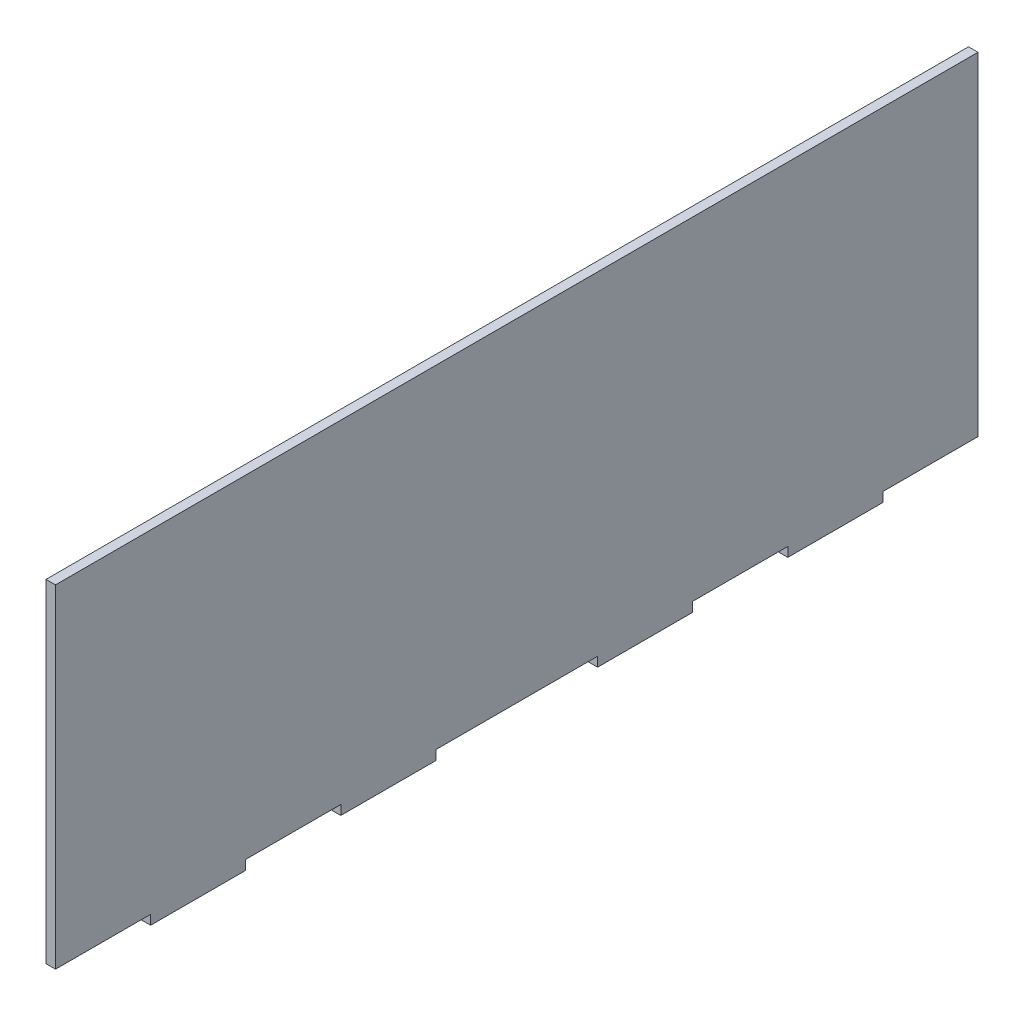
ISO-10303-21;
HEADER;
FILE_DESCRIPTION(('STEP AP214'),'2;1');
FILE_NAME('part.step','',(''),(''),'','','');
FILE_SCHEMA(('AUTOMOTIVE_DESIGN { 1 0 10303 214 1 1 1 1 }'));
ENDSEC;
DATA;
#1=APPLICATION_CONTEXT('core data for automotive mechanical design processes');
#2=APPLICATION_PROTOCOL_DEFINITION('international standard','automotive_design',2000,#1);
#3=PRODUCT_CONTEXT('',#1,'mechanical');
#4=PRODUCT('Part','Part','',(#3));
#5=PRODUCT_RELATED_PRODUCT_CATEGORY('part','',(#4));
#6=PRODUCT_DEFINITION_FORMATION('','',#4);
#7=PRODUCT_DEFINITION_CONTEXT('part definition',#1,'design');
#8=PRODUCT_DEFINITION('design','',#6,#7);
#9=PRODUCT_DEFINITION_SHAPE('','',#8);
#10=(LENGTH_UNIT() NAMED_UNIT(*) SI_UNIT(.MILLI.,.METRE.));
#11=(NAMED_UNIT(*) PLANE_ANGLE_UNIT() SI_UNIT($,.RADIAN.));
#12=(NAMED_UNIT(*) SI_UNIT($,.STERADIAN.) SOLID_ANGLE_UNIT());
#13=UNCERTAINTY_MEASURE_WITH_UNIT(LENGTH_MEASURE(1.E-05),#10,'distance_accuracy_value','');
#14=(GEOMETRIC_REPRESENTATION_CONTEXT(3) GLOBAL_UNCERTAINTY_ASSIGNED_CONTEXT((#13)) GLOBAL_UNIT_ASSIGNED_CONTEXT((#10,
#11,#12)) REPRESENTATION_CONTEXT('',''));
#15=CARTESIAN_POINT('',(0.,0.,0.));
#16=DIRECTION('',(0.,0.,1.));
#17=DIRECTION('',(1.,0.,0.));
#18=AXIS2_PLACEMENT_3D('',#15,#16,#17);
#19=CARTESIAN_POINT('',(2.,-35.,96.9999999999999));
#20=DIRECTION('',(0.,1.,0.));
#21=DIRECTION('',(0.,0.,1.));
#22=AXIS2_PLACEMENT_3D('',#19,#20,#21);
#23=PLANE('',#22);
#24=DIRECTION('',(0.,0.,-1.));
#25=VECTOR('',#24,1.);
#26=CARTESIAN_POINT('',(2.,-35.,96.9999999999999));
#27=LINE('',#26,#25);
#28=CARTESIAN_POINT('',(2.,-35.,-77.));
#29=VERTEX_POINT('',#28);
#30=CARTESIAN_POINT('',(2.,-35.,-96.9999999999999));
#31=VERTEX_POINT('',#30);
#32=EDGE_CURVE('E48',#29,#31,#27,.T.);
#33=ORIENTED_EDGE('',*,*,#32,.F.);
#34=DIRECTION('',(1.,0.,0.));
#35=VECTOR('',#34,1.);
#36=CARTESIAN_POINT('',(0.,-35.,-77.));
#37=LINE('',#36,#35);
#38=CARTESIAN_POINT('',(0.,-35.,-77.));
#39=VERTEX_POINT('',#38);
#40=EDGE_CURVE('E184',#39,#29,#37,.T.);
#41=ORIENTED_EDGE('',*,*,#40,.F.);
#42=DIRECTION('',(0.,0.,-1.));
#43=VECTOR('',#42,1.);
#44=CARTESIAN_POINT('',(0.,-35.,96.9999999999999));
#45=LINE('',#44,#43);
#46=CARTESIAN_POINT('',(0.,-35.,-96.9999999999999));
#47=VERTEX_POINT('',#46);
#48=EDGE_CURVE('E171',#39,#47,#45,.T.);
#49=ORIENTED_EDGE('',*,*,#48,.T.);
#50=DIRECTION('',(-1.,0.,0.));
#51=VECTOR('',#50,1.);
#52=CARTESIAN_POINT('',(2.,-35.,-96.9999999999999));
#53=LINE('',#52,#51);
#54=EDGE_CURVE('E301',#31,#47,#53,.T.);
#55=ORIENTED_EDGE('',*,*,#54,.F.);
#56=EDGE_LOOP('',(#33,#41,#49,#55));
#57=FACE_BOUND('',#56,.T.);
#58=ADVANCED_FACE('F33',(#57),#23,.F.);
#59=CARTESIAN_POINT('',(0.,-35.,-37.));
#60=VERTEX_POINT('',#59);
#61=CARTESIAN_POINT('',(0.,-35.,-57.));
#62=VERTEX_POINT('',#61);
#63=EDGE_CURVE('E180',#60,#62,#45,.T.);
#64=ORIENTED_EDGE('',*,*,#63,.T.);
#65=DIRECTION('',(1.,0.,0.));
#66=VECTOR('',#65,1.);
#67=CARTESIAN_POINT('',(0.,-35.,-57.));
#68=LINE('',#67,#66);
#69=CARTESIAN_POINT('',(2.,-35.,-57.));
#70=VERTEX_POINT('',#69);
#71=EDGE_CURVE('E56',#62,#70,#68,.T.);
#72=ORIENTED_EDGE('',*,*,#71,.T.);
#73=CARTESIAN_POINT('',(2.,-35.,-37.));
#74=VERTEX_POINT('',#73);
#75=EDGE_CURVE('E376',#74,#70,#27,.T.);
#76=ORIENTED_EDGE('',*,*,#75,.F.);
#77=DIRECTION('',(1.,0.,0.));
#78=VECTOR('',#77,1.);
#79=CARTESIAN_POINT('',(0.,-35.,-37.));
#80=LINE('',#79,#78);
#81=EDGE_CURVE('E221',#60,#74,#80,.T.);
#82=ORIENTED_EDGE('',*,*,#81,.F.);
#83=EDGE_LOOP('',(#64,#72,#76,#82));
#84=FACE_BOUND('',#83,.T.);
#85=ADVANCED_FACE('F342',(#84),#23,.F.);
#86=CARTESIAN_POINT('',(0.,-35.,57.));
#87=VERTEX_POINT('',#86);
#88=CARTESIAN_POINT('',(0.,-35.,37.));
#89=VERTEX_POINT('',#88);
#90=EDGE_CURVE('E307',#87,#89,#45,.T.);
#91=ORIENTED_EDGE('',*,*,#90,.T.);
#92=DIRECTION('',(1.,0.,0.));
#93=VECTOR('',#92,1.);
#94=CARTESIAN_POINT('',(0.,-35.,37.));
#95=LINE('',#94,#93);
#96=CARTESIAN_POINT('',(2.,-35.,37.));
#97=VERTEX_POINT('',#96);
#98=EDGE_CURVE('E256',#89,#97,#95,.T.);
#99=ORIENTED_EDGE('',*,*,#98,.T.);
#100=CARTESIAN_POINT('',(2.,-35.,57.));
#101=VERTEX_POINT('',#100);
#102=EDGE_CURVE('E302',#101,#97,#27,.T.);
#103=ORIENTED_EDGE('',*,*,#102,.F.);
#104=DIRECTION('',(1.,0.,0.));
#105=VECTOR('',#104,1.);
#106=CARTESIAN_POINT('',(0.,-35.,57.));
#107=LINE('',#106,#105);
#108=EDGE_CURVE('E286',#87,#101,#107,.T.);
#109=ORIENTED_EDGE('',*,*,#108,.F.);
#110=EDGE_LOOP('',(#91,#99,#103,#109));
#111=FACE_BOUND('',#110,.T.);
#112=ADVANCED_FACE('F346',(#111),#23,.F.);
#113=CARTESIAN_POINT('',(0.,-35.,17.));
#114=VERTEX_POINT('',#113);
#115=CARTESIAN_POINT('',(0.,-35.,-17.));
#116=VERTEX_POINT('',#115);
#117=EDGE_CURVE('E360',#114,#116,#45,.T.);
#118=ORIENTED_EDGE('',*,*,#117,.T.);
#119=DIRECTION('',(1.,0.,0.));
#120=VECTOR('',#119,1.);
#121=CARTESIAN_POINT('',(0.,-35.,-17.));
#122=LINE('',#121,#120);
#123=CARTESIAN_POINT('',(2.,-35.,-17.));
#124=VERTEX_POINT('',#123);
#125=EDGE_CURVE('E234',#116,#124,#122,.T.);
#126=ORIENTED_EDGE('',*,*,#125,.T.);
#127=CARTESIAN_POINT('',(2.,-35.,17.));
#128=VERTEX_POINT('',#127);
#129=EDGE_CURVE('E374',#128,#124,#27,.T.);
#130=ORIENTED_EDGE('',*,*,#129,.F.);
#131=DIRECTION('',(1.,0.,0.));
#132=VECTOR('',#131,1.);
#133=CARTESIAN_POINT('',(0.,-35.,17.));
#134=LINE('',#133,#132);
#135=EDGE_CURVE('E259',#114,#128,#134,.T.);
#136=ORIENTED_EDGE('',*,*,#135,.F.);
#137=EDGE_LOOP('',(#118,#126,#130,#136));
#138=FACE_BOUND('',#137,.T.);
#139=ADVANCED_FACE('F339',(#138),#23,.F.);
#140=CARTESIAN_POINT('',(2.,35.,97.));
#141=DIRECTION('',(0.,-1.,0.));
#142=DIRECTION('',(0.,0.,-1.));
#143=AXIS2_PLACEMENT_3D('',#140,#141,#142);
#144=PLANE('',#143);
#145=DIRECTION('',(0.,0.,1.));
#146=VECTOR('',#145,1.);
#147=CARTESIAN_POINT('',(0.,35.,97.));
#148=LINE('',#147,#146);
#149=CARTESIAN_POINT('',(0.,35.,-97.));
#150=VERTEX_POINT('',#149);
#151=CARTESIAN_POINT('',(0.,35.,97.));
#152=VERTEX_POINT('',#151);
#153=EDGE_CURVE('E285',#150,#152,#148,.T.);
#154=ORIENTED_EDGE('',*,*,#153,.T.);
#155=DIRECTION('',(-1.,0.,0.));
#156=VECTOR('',#155,1.);
#157=CARTESIAN_POINT('',(2.,35.,97.));
#158=LINE('',#157,#156);
#159=CARTESIAN_POINT('',(2.,35.,97.));
#160=VERTEX_POINT('',#159);
#161=EDGE_CURVE('E41',#160,#152,#158,.T.);
#162=ORIENTED_EDGE('',*,*,#161,.F.);
#163=DIRECTION('',(0.,0.,1.));
#164=VECTOR('',#163,1.);
#165=CARTESIAN_POINT('',(2.,35.,97.));
#166=LINE('',#165,#164);
#167=CARTESIAN_POINT('',(2.,35.,-97.));
#168=VERTEX_POINT('',#167);
#169=EDGE_CURVE('E294',#168,#160,#166,.T.);
#170=ORIENTED_EDGE('',*,*,#169,.F.);
#171=DIRECTION('',(-1.,0.,0.));
#172=VECTOR('',#171,1.);
#173=CARTESIAN_POINT('',(2.,35.,-97.));
#174=LINE('',#173,#172);
#175=EDGE_CURVE('E11',#168,#150,#174,.T.);
#176=ORIENTED_EDGE('',*,*,#175,.T.);
#177=EDGE_LOOP('',(#154,#162,#170,#176));
#178=FACE_BOUND('',#177,.T.);
#179=ADVANCED_FACE('F35',(#178),#144,.F.);
#180=CARTESIAN_POINT('',(2.,-35.,96.9999999999999));
#181=DIRECTION('',(0.,0.,-1.));
#182=DIRECTION('',(0.,1.,0.));
#183=AXIS2_PLACEMENT_3D('',#180,#181,#182);
#184=PLANE('',#183);
#185=DIRECTION('',(0.,-1.,0.));
#186=VECTOR('',#185,1.);
#187=CARTESIAN_POINT('',(0.,-35.,96.9999999999999));
#188=LINE('',#187,#186);
#189=CARTESIAN_POINT('',(0.,-35.,96.9999999999999));
#190=VERTEX_POINT('',#189);
#191=EDGE_CURVE('E181',#152,#190,#188,.T.);
#192=ORIENTED_EDGE('',*,*,#191,.T.);
#193=DIRECTION('',(-1.,0.,0.));
#194=VECTOR('',#193,1.);
#195=CARTESIAN_POINT('',(2.,-35.,96.9999999999999));
#196=LINE('',#195,#194);
#197=CARTESIAN_POINT('',(2.,-35.,96.9999999999999));
#198=VERTEX_POINT('',#197);
#199=EDGE_CURVE('E310',#198,#190,#196,.T.);
#200=ORIENTED_EDGE('',*,*,#199,.F.);
#201=DIRECTION('',(0.,-1.,0.));
#202=VECTOR('',#201,1.);
#203=CARTESIAN_POINT('',(2.,20.,97.));
#204=LINE('',#203,#202);
#205=EDGE_CURVE('E296',#160,#198,#204,.T.);
#206=ORIENTED_EDGE('',*,*,#205,.F.);
#207=ORIENTED_EDGE('',*,*,#161,.T.);
#208=EDGE_LOOP('',(#192,#200,#206,#207));
#209=FACE_BOUND('',#208,.T.);
#210=ADVANCED_FACE('F316',(#209),#184,.F.);
#211=CARTESIAN_POINT('',(0.,-35.,77.));
#212=VERTEX_POINT('',#211);
#213=EDGE_CURVE('E183',#190,#212,#45,.T.);
#214=ORIENTED_EDGE('',*,*,#213,.T.);
#215=DIRECTION('',(1.,0.,0.));
#216=VECTOR('',#215,1.);
#217=CARTESIAN_POINT('',(0.,-35.,77.));
#218=LINE('',#217,#216);
#219=CARTESIAN_POINT('',(2.,-35.,77.));
#220=VERTEX_POINT('',#219);
#221=EDGE_CURVE('E282',#212,#220,#218,.T.);
#222=ORIENTED_EDGE('',*,*,#221,.T.);
#223=EDGE_CURVE('E298',#198,#220,#27,.T.);
#224=ORIENTED_EDGE('',*,*,#223,.F.);
#225=ORIENTED_EDGE('',*,*,#199,.T.);
#226=EDGE_LOOP('',(#214,#222,#224,#225));
#227=FACE_BOUND('',#226,.T.);
#228=ADVANCED_FACE('F324',(#227),#23,.F.);
#229=CARTESIAN_POINT('',(2.,-35.,-96.9999999999999));
#230=DIRECTION('',(0.,0.,1.));
#231=DIRECTION('',(0.,-1.,0.));
#232=AXIS2_PLACEMENT_3D('',#229,#230,#231);
#233=PLANE('',#232);
#234=DIRECTION('',(0.,1.,0.));
#235=VECTOR('',#234,1.);
#236=CARTESIAN_POINT('',(0.,-35.,-96.9999999999999));
#237=LINE('',#236,#235);
#238=EDGE_CURVE('E178',#47,#150,#237,.T.);
#239=ORIENTED_EDGE('',*,*,#238,.T.);
#240=ORIENTED_EDGE('',*,*,#175,.F.);
#241=DIRECTION('',(0.,1.,0.));
#242=VECTOR('',#241,1.);
#243=CARTESIAN_POINT('',(2.,20.,-97.));
#244=LINE('',#243,#242);
#245=EDGE_CURVE('E291',#31,#168,#244,.T.);
#246=ORIENTED_EDGE('',*,*,#245,.F.);
#247=ORIENTED_EDGE('',*,*,#54,.T.);
#248=EDGE_LOOP('',(#239,#240,#246,#247));
#249=FACE_BOUND('',#248,.T.);
#250=ADVANCED_FACE('F330',(#249),#233,.F.);
#251=CARTESIAN_POINT('',(2.,0.,0.));
#252=DIRECTION('',(-1.,0.,0.));
#253=DIRECTION('',(0.,0.,1.));
#254=AXIS2_PLACEMENT_3D('',#251,#252,#253);
#255=PLANE('',#254);
#256=ORIENTED_EDGE('',*,*,#205,.T.);
#257=ORIENTED_EDGE('',*,*,#223,.T.);
#258=DIRECTION('',(0.,-1.,0.));
#259=VECTOR('',#258,1.);
#260=CARTESIAN_POINT('',(2.,-35.,77.));
#261=LINE('',#260,#259);
#262=CARTESIAN_POINT('',(2.,-37.,77.));
#263=VERTEX_POINT('',#262);
#264=EDGE_CURVE('E258',#220,#263,#261,.T.);
#265=ORIENTED_EDGE('',*,*,#264,.T.);
#266=DIRECTION('',(0.,0.,-1.));
#267=VECTOR('',#266,1.);
#268=CARTESIAN_POINT('',(2.,-37.,77.));
#269=LINE('',#268,#267);
#270=CARTESIAN_POINT('',(2.,-37.,57.));
#271=VERTEX_POINT('',#270);
#272=EDGE_CURVE('E277',#263,#271,#269,.T.);
#273=ORIENTED_EDGE('',*,*,#272,.T.);
#274=DIRECTION('',(0.,1.,0.));
#275=VECTOR('',#274,1.);
#276=CARTESIAN_POINT('',(2.,-35.,57.));
#277=LINE('',#276,#275);
#278=EDGE_CURVE('E269',#271,#101,#277,.T.);
#279=ORIENTED_EDGE('',*,*,#278,.T.);
#280=ORIENTED_EDGE('',*,*,#102,.T.);
#281=DIRECTION('',(0.,-1.,0.));
#282=VECTOR('',#281,1.);
#283=CARTESIAN_POINT('',(2.,-35.,37.));
#284=LINE('',#283,#282);
#285=CARTESIAN_POINT('',(2.,-37.,37.));
#286=VERTEX_POINT('',#285);
#287=EDGE_CURVE('E231',#97,#286,#284,.T.);
#288=ORIENTED_EDGE('',*,*,#287,.T.);
#289=DIRECTION('',(0.,0.,-1.));
#290=VECTOR('',#289,1.);
#291=CARTESIAN_POINT('',(2.,-37.,37.));
#292=LINE('',#291,#290);
#293=CARTESIAN_POINT('',(2.,-37.,17.));
#294=VERTEX_POINT('',#293);
#295=EDGE_CURVE('E251',#286,#294,#292,.T.);
#296=ORIENTED_EDGE('',*,*,#295,.T.);
#297=DIRECTION('',(0.,1.,0.));
#298=VECTOR('',#297,1.);
#299=CARTESIAN_POINT('',(2.,-35.,17.));
#300=LINE('',#299,#298);
#301=EDGE_CURVE('E242',#294,#128,#300,.T.);
#302=ORIENTED_EDGE('',*,*,#301,.T.);
#303=ORIENTED_EDGE('',*,*,#129,.T.);
#304=DIRECTION('',(0.,-1.,0.));
#305=VECTOR('',#304,1.);
#306=CARTESIAN_POINT('',(2.,-35.,-17.));
#307=LINE('',#306,#305);
#308=CARTESIAN_POINT('',(2.,-37.,-17.));
#309=VERTEX_POINT('',#308);
#310=EDGE_CURVE('E224',#124,#309,#307,.T.);
#311=ORIENTED_EDGE('',*,*,#310,.T.);
#312=DIRECTION('',(0.,0.,-1.));
#313=VECTOR('',#312,1.);
#314=CARTESIAN_POINT('',(2.,-37.,-37.));
#315=LINE('',#314,#313);
#316=CARTESIAN_POINT('',(2.,-37.,-37.));
#317=VERTEX_POINT('',#316);
#318=EDGE_CURVE('E215',#309,#317,#315,.T.);
#319=ORIENTED_EDGE('',*,*,#318,.T.);
#320=DIRECTION('',(0.,1.,0.));
#321=VECTOR('',#320,1.);
#322=CARTESIAN_POINT('',(2.,-35.,-37.));
#323=LINE('',#322,#321);
#324=EDGE_CURVE('E207',#317,#74,#323,.T.);
#325=ORIENTED_EDGE('',*,*,#324,.T.);
#326=ORIENTED_EDGE('',*,*,#75,.T.);
#327=DIRECTION('',(0.,-1.,0.));
#328=VECTOR('',#327,1.);
#329=CARTESIAN_POINT('',(2.,-35.,-57.));
#330=LINE('',#329,#328);
#331=CARTESIAN_POINT('',(2.,-37.,-57.));
#332=VERTEX_POINT('',#331);
#333=EDGE_CURVE('E198',#70,#332,#330,.T.);
#334=ORIENTED_EDGE('',*,*,#333,.T.);
#335=DIRECTION('',(0.,0.,-1.));
#336=VECTOR('',#335,1.);
#337=CARTESIAN_POINT('',(2.,-37.,-77.));
#338=LINE('',#337,#336);
#339=CARTESIAN_POINT('',(2.,-37.,-77.));
#340=VERTEX_POINT('',#339);
#341=EDGE_CURVE('E193',#332,#340,#338,.T.);
#342=ORIENTED_EDGE('',*,*,#341,.T.);
#343=DIRECTION('',(0.,1.,0.));
#344=VECTOR('',#343,1.);
#345=CARTESIAN_POINT('',(2.,-35.,-77.));
#346=LINE('',#345,#344);
#347=EDGE_CURVE('E202',#340,#29,#346,.T.);
#348=ORIENTED_EDGE('',*,*,#347,.T.);
#349=ORIENTED_EDGE('',*,*,#32,.T.);
#350=ORIENTED_EDGE('',*,*,#245,.T.);
#351=ORIENTED_EDGE('',*,*,#169,.T.);
#352=EDGE_LOOP('',(#256,#257,#265,#273,#279,#280,#288,#296,#302,#303,#311,#319,#325,#326,#334,
#342,#348,#349,#350,#351));
#353=FACE_BOUND('',#352,.T.);
#354=ADVANCED_FACE('F327',(#353),#255,.F.);
#355=CARTESIAN_POINT('',(0.,0.,0.));
#356=DIRECTION('',(-1.,0.,0.));
#357=DIRECTION('',(0.,0.,1.));
#358=AXIS2_PLACEMENT_3D('',#355,#356,#357);
#359=PLANE('',#358);
#360=ORIENTED_EDGE('',*,*,#191,.F.);
#361=ORIENTED_EDGE('',*,*,#153,.F.);
#362=ORIENTED_EDGE('',*,*,#238,.F.);
#363=ORIENTED_EDGE('',*,*,#48,.F.);
#364=DIRECTION('',(0.,1.,0.));
#365=VECTOR('',#364,1.);
#366=CARTESIAN_POINT('',(0.,-35.,-77.));
#367=LINE('',#366,#365);
#368=CARTESIAN_POINT('',(0.,-37.,-77.));
#369=VERTEX_POINT('',#368);
#370=EDGE_CURVE('E175',#369,#39,#367,.T.);
#371=ORIENTED_EDGE('',*,*,#370,.F.);
#372=DIRECTION('',(0.,0.,-1.));
#373=VECTOR('',#372,1.);
#374=CARTESIAN_POINT('',(0.,-37.,-77.));
#375=LINE('',#374,#373);
#376=CARTESIAN_POINT('',(0.,-37.,-57.));
#377=VERTEX_POINT('',#376);
#378=EDGE_CURVE('E188',#377,#369,#375,.T.);
#379=ORIENTED_EDGE('',*,*,#378,.F.);
#380=DIRECTION('',(0.,-1.,0.));
#381=VECTOR('',#380,1.);
#382=CARTESIAN_POINT('',(0.,-35.,-57.));
#383=LINE('',#382,#381);
#384=EDGE_CURVE('E192',#62,#377,#383,.T.);
#385=ORIENTED_EDGE('',*,*,#384,.F.);
#386=ORIENTED_EDGE('',*,*,#63,.F.);
#387=DIRECTION('',(0.,1.,0.));
#388=VECTOR('',#387,1.);
#389=CARTESIAN_POINT('',(0.,-35.,-37.));
#390=LINE('',#389,#388);
#391=CARTESIAN_POINT('',(0.,-37.,-37.));
#392=VERTEX_POINT('',#391);
#393=EDGE_CURVE('E211',#392,#60,#390,.T.);
#394=ORIENTED_EDGE('',*,*,#393,.F.);
#395=DIRECTION('',(0.,0.,-1.));
#396=VECTOR('',#395,1.);
#397=CARTESIAN_POINT('',(0.,-37.,-37.));
#398=LINE('',#397,#396);
#399=CARTESIAN_POINT('',(0.,-37.,-17.));
#400=VERTEX_POINT('',#399);
#401=EDGE_CURVE('E218',#400,#392,#398,.T.);
#402=ORIENTED_EDGE('',*,*,#401,.F.);
#403=DIRECTION('',(0.,-1.,0.));
#404=VECTOR('',#403,1.);
#405=CARTESIAN_POINT('',(0.,-35.,-17.));
#406=LINE('',#405,#404);
#407=EDGE_CURVE('E214',#116,#400,#406,.T.);
#408=ORIENTED_EDGE('',*,*,#407,.F.);
#409=ORIENTED_EDGE('',*,*,#117,.F.);
#410=DIRECTION('',(0.,1.,0.));
#411=VECTOR('',#410,1.);
#412=CARTESIAN_POINT('',(0.,-35.,17.));
#413=LINE('',#412,#411);
#414=CARTESIAN_POINT('',(0.,-37.,17.));
#415=VERTEX_POINT('',#414);
#416=EDGE_CURVE('E245',#415,#114,#413,.T.);
#417=ORIENTED_EDGE('',*,*,#416,.F.);
#418=DIRECTION('',(0.,0.,-1.));
#419=VECTOR('',#418,1.);
#420=CARTESIAN_POINT('',(0.,-37.,37.));
#421=LINE('',#420,#419);
#422=CARTESIAN_POINT('',(0.,-37.,37.));
#423=VERTEX_POINT('',#422);
#424=EDGE_CURVE('E241',#423,#415,#421,.T.);
#425=ORIENTED_EDGE('',*,*,#424,.F.);
#426=DIRECTION('',(0.,-1.,0.));
#427=VECTOR('',#426,1.);
#428=CARTESIAN_POINT('',(0.,-35.,37.));
#429=LINE('',#428,#427);
#430=EDGE_CURVE('E238',#89,#423,#429,.T.);
#431=ORIENTED_EDGE('',*,*,#430,.F.);
#432=ORIENTED_EDGE('',*,*,#90,.F.);
#433=DIRECTION('',(0.,1.,0.));
#434=VECTOR('',#433,1.);
#435=CARTESIAN_POINT('',(0.,-35.,57.));
#436=LINE('',#435,#434);
#437=CARTESIAN_POINT('',(0.,-37.,57.));
#438=VERTEX_POINT('',#437);
#439=EDGE_CURVE('E272',#438,#87,#436,.T.);
#440=ORIENTED_EDGE('',*,*,#439,.F.);
#441=DIRECTION('',(0.,0.,-1.));
#442=VECTOR('',#441,1.);
#443=CARTESIAN_POINT('',(0.,-37.,77.));
#444=LINE('',#443,#442);
#445=CARTESIAN_POINT('',(0.,-37.,77.));
#446=VERTEX_POINT('',#445);
#447=EDGE_CURVE('E268',#446,#438,#444,.T.);
#448=ORIENTED_EDGE('',*,*,#447,.F.);
#449=DIRECTION('',(0.,-1.,0.));
#450=VECTOR('',#449,1.);
#451=CARTESIAN_POINT('',(0.,-35.,77.));
#452=LINE('',#451,#450);
#453=EDGE_CURVE('E265',#212,#446,#452,.T.);
#454=ORIENTED_EDGE('',*,*,#453,.F.);
#455=ORIENTED_EDGE('',*,*,#213,.F.);
#456=EDGE_LOOP('',(#360,#361,#362,#363,#371,#379,#385,#386,#394,#402,#408,#409,#417,#425,#431,
#432,#440,#448,#454,#455));
#457=FACE_BOUND('',#456,.T.);
#458=ADVANCED_FACE('F172',(#457),#359,.T.);
#459=CARTESIAN_POINT('',(0.,-35.,77.));
#460=DIRECTION('',(0.,0.,1.));
#461=DIRECTION('',(1.,0.,0.));
#462=AXIS2_PLACEMENT_3D('',#459,#460,#461);
#463=PLANE('',#462);
#464=ORIENTED_EDGE('',*,*,#264,.F.);
#465=ORIENTED_EDGE('',*,*,#221,.F.);
#466=ORIENTED_EDGE('',*,*,#453,.T.);
#467=DIRECTION('',(1.,0.,0.));
#468=VECTOR('',#467,1.);
#469=CARTESIAN_POINT('',(0.,-37.,77.));
#470=LINE('',#469,#468);
#471=EDGE_CURVE('E274',#446,#263,#470,.T.);
#472=ORIENTED_EDGE('',*,*,#471,.T.);
#473=EDGE_LOOP('',(#464,#465,#466,#472));
#474=FACE_BOUND('',#473,.T.);
#475=ADVANCED_FACE('F412',(#474),#463,.T.);
#476=CARTESIAN_POINT('',(0.,-35.,57.));
#477=DIRECTION('',(0.,0.,-1.));
#478=DIRECTION('',(-1.,0.,0.));
#479=AXIS2_PLACEMENT_3D('',#476,#477,#478);
#480=PLANE('',#479);
#481=ORIENTED_EDGE('',*,*,#278,.F.);
#482=DIRECTION('',(1.,0.,0.));
#483=VECTOR('',#482,1.);
#484=CARTESIAN_POINT('',(0.,-37.,57.));
#485=LINE('',#484,#483);
#486=EDGE_CURVE('E288',#438,#271,#485,.T.);
#487=ORIENTED_EDGE('',*,*,#486,.F.);
#488=ORIENTED_EDGE('',*,*,#439,.T.);
#489=ORIENTED_EDGE('',*,*,#108,.T.);
#490=EDGE_LOOP('',(#481,#487,#488,#489));
#491=FACE_BOUND('',#490,.T.);
#492=ADVANCED_FACE('F409',(#491),#480,.T.);
#493=CARTESIAN_POINT('',(0.,-37.,77.));
#494=DIRECTION('',(0.,-1.,0.));
#495=DIRECTION('',(0.,0.,-1.));
#496=AXIS2_PLACEMENT_3D('',#493,#494,#495);
#497=PLANE('',#496);
#498=ORIENTED_EDGE('',*,*,#272,.F.);
#499=ORIENTED_EDGE('',*,*,#471,.F.);
#500=ORIENTED_EDGE('',*,*,#447,.T.);
#501=ORIENTED_EDGE('',*,*,#486,.T.);
#502=EDGE_LOOP('',(#498,#499,#500,#501));
#503=FACE_BOUND('',#502,.T.);
#504=ADVANCED_FACE('F407',(#503),#497,.T.);
#505=CARTESIAN_POINT('',(0.,-35.,37.));
#506=DIRECTION('',(0.,0.,1.));
#507=DIRECTION('',(1.,0.,0.));
#508=AXIS2_PLACEMENT_3D('',#505,#506,#507);
#509=PLANE('',#508);
#510=ORIENTED_EDGE('',*,*,#287,.F.);
#511=ORIENTED_EDGE('',*,*,#98,.F.);
#512=ORIENTED_EDGE('',*,*,#430,.T.);
#513=DIRECTION('',(1.,0.,0.));
#514=VECTOR('',#513,1.);
#515=CARTESIAN_POINT('',(0.,-37.,37.));
#516=LINE('',#515,#514);
#517=EDGE_CURVE('E248',#423,#286,#516,.T.);
#518=ORIENTED_EDGE('',*,*,#517,.T.);
#519=EDGE_LOOP('',(#510,#511,#512,#518));
#520=FACE_BOUND('',#519,.T.);
#521=ADVANCED_FACE('F402',(#520),#509,.T.);
#522=CARTESIAN_POINT('',(0.,-35.,17.));
#523=DIRECTION('',(0.,0.,-1.));
#524=DIRECTION('',(-1.,0.,0.));
#525=AXIS2_PLACEMENT_3D('',#522,#523,#524);
#526=PLANE('',#525);
#527=ORIENTED_EDGE('',*,*,#301,.F.);
#528=DIRECTION('',(1.,0.,0.));
#529=VECTOR('',#528,1.);
#530=CARTESIAN_POINT('',(0.,-37.,17.));
#531=LINE('',#530,#529);
#532=EDGE_CURVE('E262',#415,#294,#531,.T.);
#533=ORIENTED_EDGE('',*,*,#532,.F.);
#534=ORIENTED_EDGE('',*,*,#416,.T.);
#535=ORIENTED_EDGE('',*,*,#135,.T.);
#536=EDGE_LOOP('',(#527,#533,#534,#535));
#537=FACE_BOUND('',#536,.T.);
#538=ADVANCED_FACE('F396',(#537),#526,.T.);
#539=CARTESIAN_POINT('',(0.,-37.,37.));
#540=DIRECTION('',(0.,-1.,0.));
#541=DIRECTION('',(0.,0.,-1.));
#542=AXIS2_PLACEMENT_3D('',#539,#540,#541);
#543=PLANE('',#542);
#544=ORIENTED_EDGE('',*,*,#295,.F.);
#545=ORIENTED_EDGE('',*,*,#517,.F.);
#546=ORIENTED_EDGE('',*,*,#424,.T.);
#547=ORIENTED_EDGE('',*,*,#532,.T.);
#548=EDGE_LOOP('',(#544,#545,#546,#547));
#549=FACE_BOUND('',#548,.T.);
#550=ADVANCED_FACE('F389',(#549),#543,.T.);
#551=CARTESIAN_POINT('',(0.,-35.,-37.));
#552=DIRECTION('',(0.,0.,-1.));
#553=DIRECTION('',(-1.,0.,0.));
#554=AXIS2_PLACEMENT_3D('',#551,#552,#553);
#555=PLANE('',#554);
#556=ORIENTED_EDGE('',*,*,#324,.F.);
#557=DIRECTION('',(1.,0.,0.));
#558=VECTOR('',#557,1.);
#559=CARTESIAN_POINT('',(0.,-37.,-37.));
#560=LINE('',#559,#558);
#561=EDGE_CURVE('E229',#392,#317,#560,.T.);
#562=ORIENTED_EDGE('',*,*,#561,.F.);
#563=ORIENTED_EDGE('',*,*,#393,.T.);
#564=ORIENTED_EDGE('',*,*,#81,.T.);
#565=EDGE_LOOP('',(#556,#562,#563,#564));
#566=FACE_BOUND('',#565,.T.);
#567=ADVANCED_FACE('F387',(#566),#555,.T.);
#568=CARTESIAN_POINT('',(0.,-37.,-37.));
#569=DIRECTION('',(0.,-1.,0.));
#570=DIRECTION('',(0.,0.,-1.));
#571=AXIS2_PLACEMENT_3D('',#568,#569,#570);
#572=PLANE('',#571);
#573=ORIENTED_EDGE('',*,*,#318,.F.);
#574=DIRECTION('',(1.,0.,0.));
#575=VECTOR('',#574,1.);
#576=CARTESIAN_POINT('',(0.,-37.,-17.));
#577=LINE('',#576,#575);
#578=EDGE_CURVE('E232',#400,#309,#577,.T.);
#579=ORIENTED_EDGE('',*,*,#578,.F.);
#580=ORIENTED_EDGE('',*,*,#401,.T.);
#581=ORIENTED_EDGE('',*,*,#561,.T.);
#582=EDGE_LOOP('',(#573,#579,#580,#581));
#583=FACE_BOUND('',#582,.T.);
#584=ADVANCED_FACE('F372',(#583),#572,.T.);
#585=CARTESIAN_POINT('',(0.,-35.,-17.));
#586=DIRECTION('',(0.,0.,1.));
#587=DIRECTION('',(1.,0.,0.));
#588=AXIS2_PLACEMENT_3D('',#585,#586,#587);
#589=PLANE('',#588);
#590=ORIENTED_EDGE('',*,*,#310,.F.);
#591=ORIENTED_EDGE('',*,*,#125,.F.);
#592=ORIENTED_EDGE('',*,*,#407,.T.);
#593=ORIENTED_EDGE('',*,*,#578,.T.);
#594=EDGE_LOOP('',(#590,#591,#592,#593));
#595=FACE_BOUND('',#594,.T.);
#596=ADVANCED_FACE('F367',(#595),#589,.T.);
#597=CARTESIAN_POINT('',(0.,-35.,-77.));
#598=DIRECTION('',(0.,0.,-1.));
#599=DIRECTION('',(-1.,0.,0.));
#600=AXIS2_PLACEMENT_3D('',#597,#598,#599);
#601=PLANE('',#600);
#602=ORIENTED_EDGE('',*,*,#347,.F.);
#603=DIRECTION('',(1.,0.,0.));
#604=VECTOR('',#603,1.);
#605=CARTESIAN_POINT('',(0.,-37.,-77.));
#606=LINE('',#605,#604);
#607=EDGE_CURVE('E191',#369,#340,#606,.T.);
#608=ORIENTED_EDGE('',*,*,#607,.F.);
#609=ORIENTED_EDGE('',*,*,#370,.T.);
#610=ORIENTED_EDGE('',*,*,#40,.T.);
#611=EDGE_LOOP('',(#602,#608,#609,#610));
#612=FACE_BOUND('',#611,.T.);
#613=ADVANCED_FACE('F190',(#612),#601,.T.);
#614=CARTESIAN_POINT('',(0.,-37.,-77.));
#615=DIRECTION('',(0.,-1.,0.));
#616=DIRECTION('',(0.,0.,-1.));
#617=AXIS2_PLACEMENT_3D('',#614,#615,#616);
#618=PLANE('',#617);
#619=ORIENTED_EDGE('',*,*,#341,.F.);
#620=DIRECTION('',(1.,0.,0.));
#621=VECTOR('',#620,1.);
#622=CARTESIAN_POINT('',(0.,-37.,-57.));
#623=LINE('',#622,#621);
#624=EDGE_CURVE('E208',#377,#332,#623,.T.);
#625=ORIENTED_EDGE('',*,*,#624,.F.);
#626=ORIENTED_EDGE('',*,*,#378,.T.);
#627=ORIENTED_EDGE('',*,*,#607,.T.);
#628=EDGE_LOOP('',(#619,#625,#626,#627));
#629=FACE_BOUND('',#628,.T.);
#630=ADVANCED_FACE('F385',(#629),#618,.T.);
#631=CARTESIAN_POINT('',(0.,-35.,-57.));
#632=DIRECTION('',(0.,0.,1.));
#633=DIRECTION('',(1.,0.,0.));
#634=AXIS2_PLACEMENT_3D('',#631,#632,#633);
#635=PLANE('',#634);
#636=ORIENTED_EDGE('',*,*,#333,.F.);
#637=ORIENTED_EDGE('',*,*,#71,.F.);
#638=ORIENTED_EDGE('',*,*,#384,.T.);
#639=ORIENTED_EDGE('',*,*,#624,.T.);
#640=EDGE_LOOP('',(#636,#637,#638,#639));
#641=FACE_BOUND('',#640,.T.);
#642=ADVANCED_FACE('F382',(#641),#635,.T.);
#643=CLOSED_SHELL('',(#58,#85,#112,#139,#179,#210,#228,#250,#354,#458,#475,#492,#504,#521,#538,
#550,#567,#584,#596,#613,#630,#642));
#644=MANIFOLD_SOLID_BREP('B2',#643);
#645=ADVANCED_BREP_SHAPE_REPRESENTATION('',(#18,#644),#14);
#646=SHAPE_DEFINITION_REPRESENTATION(#9,#645);
ENDSEC;
END-ISO-10303-21;
